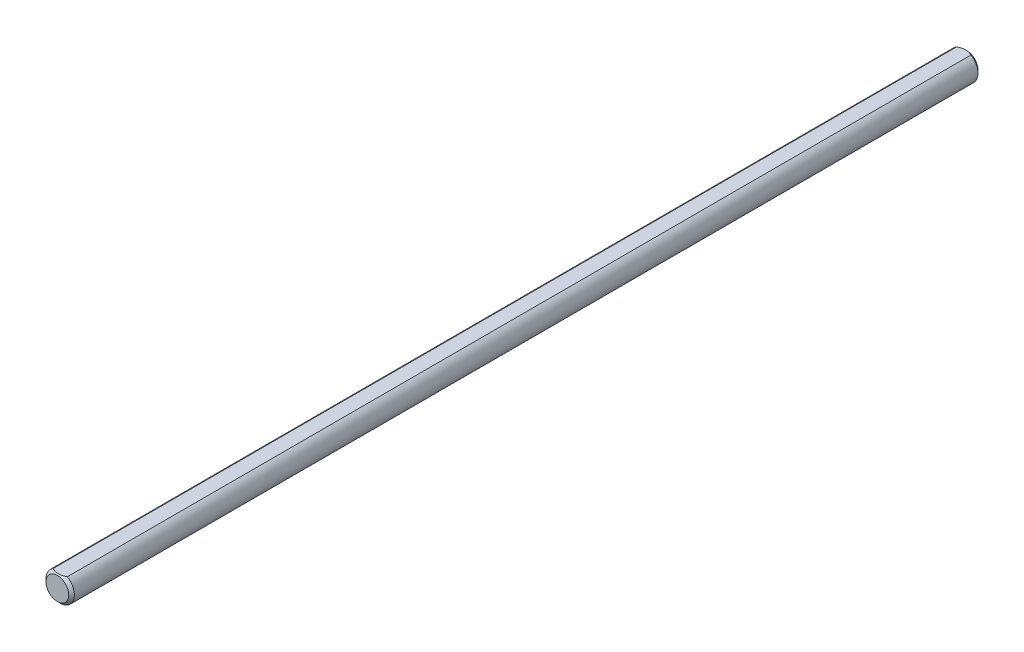
ISO-10303-21;
HEADER;
FILE_DESCRIPTION(('STEP AP214'),'2;1');
FILE_NAME('part.step','',(''),(''),'','','');
FILE_SCHEMA(('AUTOMOTIVE_DESIGN { 1 0 10303 214 1 1 1 1 }'));
ENDSEC;
DATA;
#1=APPLICATION_CONTEXT('core data for automotive mechanical design processes');
#2=APPLICATION_PROTOCOL_DEFINITION('international standard','automotive_design',2000,#1);
#3=PRODUCT_CONTEXT('',#1,'mechanical');
#4=PRODUCT('Part','Part','',(#3));
#5=PRODUCT_RELATED_PRODUCT_CATEGORY('part','',(#4));
#6=PRODUCT_DEFINITION_FORMATION('','',#4);
#7=PRODUCT_DEFINITION_CONTEXT('part definition',#1,'design');
#8=PRODUCT_DEFINITION('design','',#6,#7);
#9=PRODUCT_DEFINITION_SHAPE('','',#8);
#10=(LENGTH_UNIT() NAMED_UNIT(*) SI_UNIT(.MILLI.,.METRE.));
#11=(NAMED_UNIT(*) PLANE_ANGLE_UNIT() SI_UNIT($,.RADIAN.));
#12=(NAMED_UNIT(*) SI_UNIT($,.STERADIAN.) SOLID_ANGLE_UNIT());
#13=UNCERTAINTY_MEASURE_WITH_UNIT(LENGTH_MEASURE(1.E-05),#10,'distance_accuracy_value','');
#14=(GEOMETRIC_REPRESENTATION_CONTEXT(3) GLOBAL_UNCERTAINTY_ASSIGNED_CONTEXT((#13)) GLOBAL_UNIT_ASSIGNED_CONTEXT((#10,
#11,#12)) REPRESENTATION_CONTEXT('',''));
#15=CARTESIAN_POINT('',(0.,0.,0.));
#16=DIRECTION('',(0.,0.,1.));
#17=DIRECTION('',(1.,0.,0.));
#18=AXIS2_PLACEMENT_3D('',#15,#16,#17);
#19=CARTESIAN_POINT('',(0.,0.,101.6));
#20=DIRECTION('',(0.,0.,-1.));
#21=DIRECTION('',(-1.,0.,0.));
#22=AXIS2_PLACEMENT_3D('',#19,#20,#21);
#23=CYLINDRICAL_SURFACE('',#22,3.175);
#24=CARTESIAN_POINT('',(0.,0.,100.965));
#25=DIRECTION('',(0.,0.,1.));
#26=DIRECTION('',(1.,0.,0.));
#27=AXIS2_PLACEMENT_3D('',#24,#25,#26);
#28=CIRCLE('',#27,3.175);
#29=CARTESIAN_POINT('',(1.5875,2.74963065701559,100.965));
#30=VERTEX_POINT('',#29);
#31=CARTESIAN_POINT('',(-1.5875,2.74963065701559,100.965));
#32=VERTEX_POINT('',#31);
#33=EDGE_CURVE('E84',#30,#32,#28,.F.);
#34=ORIENTED_EDGE('',*,*,#33,.T.);
#35=DIRECTION('',(0.,0.,1.));
#36=VECTOR('',#35,1.);
#37=CARTESIAN_POINT('',(-1.5875,2.74963065701559,-101.6));
#38=LINE('',#37,#36);
#39=CARTESIAN_POINT('',(-1.5875,2.74963065701559,-100.965));
#40=VERTEX_POINT('',#39);
#41=EDGE_CURVE('E60',#40,#32,#38,.T.);
#42=ORIENTED_EDGE('',*,*,#41,.F.);
#43=CARTESIAN_POINT('',(0.,0.,-100.965));
#44=DIRECTION('',(0.,0.,1.));
#45=DIRECTION('',(1.,0.,0.));
#46=AXIS2_PLACEMENT_3D('',#43,#44,#45);
#47=CIRCLE('',#46,3.175);
#48=CARTESIAN_POINT('',(1.5875,2.74963065701559,-100.965));
#49=VERTEX_POINT('',#48);
#50=EDGE_CURVE('E82',#40,#49,#47,.T.);
#51=ORIENTED_EDGE('',*,*,#50,.T.);
#52=DIRECTION('',(0.,0.,1.));
#53=VECTOR('',#52,1.);
#54=CARTESIAN_POINT('',(1.5875,2.74963065701559,-101.6));
#55=LINE('',#54,#53);
#56=EDGE_CURVE('E70',#49,#30,#55,.T.);
#57=ORIENTED_EDGE('',*,*,#56,.T.);
#58=EDGE_LOOP('',(#34,#42,#51,#57));
#59=FACE_BOUND('',#58,.T.);
#60=ADVANCED_FACE('F39',(#59),#23,.T.);
#61=CARTESIAN_POINT('',(0.,0.,101.6));
#62=DIRECTION('',(0.,0.,1.));
#63=DIRECTION('',(1.,0.,0.));
#64=AXIS2_PLACEMENT_3D('',#61,#62,#63);
#65=PLANE('',#64);
#66=CARTESIAN_POINT('',(0.,0.,101.6));
#67=DIRECTION('',(0.,0.,1.));
#68=DIRECTION('',(1.,0.,0.));
#69=AXIS2_PLACEMENT_3D('',#66,#67,#68);
#70=CIRCLE('',#69,2.54000000000004);
#71=CARTESIAN_POINT('',(2.54000000000004,0.,101.6));
#72=VERTEX_POINT('',#71);
#73=EDGE_CURVE('E54',#72,#72,#70,.T.);
#74=ORIENTED_EDGE('',*,*,#73,.T.);
#75=EDGE_LOOP('',(#74));
#76=FACE_BOUND('',#75,.T.);
#77=ADVANCED_FACE('F98',(#76),#65,.T.);
#78=CARTESIAN_POINT('',(0.,0.,-101.6));
#79=DIRECTION('',(0.,0.,1.));
#80=DIRECTION('',(1.,0.,0.));
#81=AXIS2_PLACEMENT_3D('',#78,#79,#80);
#82=PLANE('',#81);
#83=CARTESIAN_POINT('',(0.,0.,-101.6));
#84=DIRECTION('',(0.,0.,1.));
#85=DIRECTION('',(1.,0.,0.));
#86=AXIS2_PLACEMENT_3D('',#83,#84,#85);
#87=CIRCLE('',#86,2.54000000000004);
#88=CARTESIAN_POINT('',(2.54000000000004,0.,-101.6));
#89=VERTEX_POINT('',#88);
#90=EDGE_CURVE('E87',#89,#89,#87,.F.);
#91=ORIENTED_EDGE('',*,*,#90,.T.);
#92=EDGE_LOOP('',(#91));
#93=FACE_BOUND('',#92,.T.);
#94=ADVANCED_FACE('F106',(#93),#82,.F.);
#95=CARTESIAN_POINT('',(0.,0.,-100.965));
#96=DIRECTION('',(0.,0.,1.));
#97=DIRECTION('',(1.,0.,0.));
#98=AXIS2_PLACEMENT_3D('',#95,#96,#97);
#99=CONICAL_SURFACE('',#98,3.175,0.78539816339744);
#100=CARTESIAN_POINT('',(-3.22896135223729,2.74963065701559,-99.8989317189838));
#101=CARTESIAN_POINT('',(-3.15061649550104,2.74963065701559,-99.958566524546));
#102=CARTESIAN_POINT('',(-3.07184009651263,2.74963065701559,-100.017643482025));
#103=CARTESIAN_POINT('',(-2.91325130568818,2.74963065701559,-100.134429717618));
#104=CARTESIAN_POINT('',(-2.83343866506294,2.74963065701559,-100.192138657526));
#105=CARTESIAN_POINT('',(-2.67202062852746,2.74963065701559,-100.306347547805));
#106=CARTESIAN_POINT('',(-2.59040613970429,2.74963065701559,-100.362834689537));
#107=CARTESIAN_POINT('',(-2.42580311622164,2.74963065701559,-100.473763514334));
#108=CARTESIAN_POINT('',(-2.34281467809335,2.74963065701559,-100.528205340229));
#109=CARTESIAN_POINT('',(-2.17021447787229,2.74963065701559,-100.637773871166));
#110=CARTESIAN_POINT('',(-2.08050398524193,2.74963065701559,-100.69274583534));
#111=CARTESIAN_POINT('',(-1.89900904678691,2.74963065701559,-100.799146993198));
#112=CARTESIAN_POINT('',(-1.80722487525635,2.74963065701559,-100.850576651835));
#113=CARTESIAN_POINT('',(-1.6215376036893,2.74963065701559,-100.948814805051));
#114=CARTESIAN_POINT('',(-1.52764140922494,2.74963065701559,-100.995636250177));
#115=CARTESIAN_POINT('',(-1.337247065721,2.74963065701559,-101.083600815341));
#116=CARTESIAN_POINT('',(-1.24075014112708,2.74963065701559,-101.124746553594));
#117=CARTESIAN_POINT('',(-1.05364742760749,2.74963065701559,-101.196556437231));
#118=CARTESIAN_POINT('',(-0.963276425588649,2.74963065701559,-101.227826043973));
#119=CARTESIAN_POINT('',(-0.780303735161117,2.74963065701559,-101.28312318735));
#120=CARTESIAN_POINT('',(-0.687701898779476,2.74963065701559,-101.307150242145));
#121=CARTESIAN_POINT('',(-0.502391431282867,2.74963065701559,-101.346288290841));
#122=CARTESIAN_POINT('',(-0.409716445146773,2.74963065701559,-101.361555954749));
#123=CARTESIAN_POINT('',(-0.223306330685287,2.74963065701559,-101.382868842029));
#124=CARTESIAN_POINT('',(-0.129571403437391,2.74963065701559,-101.388915786014));
#125=CARTESIAN_POINT('',(0.0543357559016512,2.74963065701559,-101.391309485248));
#126=CARTESIAN_POINT('',(0.144503242552339,2.74963065701559,-101.388028086228));
#127=CARTESIAN_POINT('',(0.324095543573382,2.74963065701559,-101.372781771964));
#128=CARTESIAN_POINT('',(0.413520286896835,2.74963065701559,-101.360816035481));
#129=CARTESIAN_POINT('',(0.59249606602404,2.74963065701559,-101.328661523536));
#130=CARTESIAN_POINT('',(0.682021177378985,2.74963065701559,-101.308330580175));
#131=CARTESIAN_POINT('',(0.859103373963789,2.74963065701559,-101.260545197954));
#132=CARTESIAN_POINT('',(0.946660601088747,2.74963065701559,-101.233091274501));
#133=CARTESIAN_POINT('',(1.21954622680458,2.74963065701559,-101.13712948219));
#134=CARTESIAN_POINT('',(1.4010859401266,2.74963065701559,-101.057809452736));
#135=CARTESIAN_POINT('',(1.66675889489853,2.74963065701559,-100.925553985226));
#136=CARTESIAN_POINT('',(1.7543748838501,2.74963065701559,-100.879152661124));
#137=CARTESIAN_POINT('',(1.92761951465593,2.74963065701559,-100.782769237768));
#138=CARTESIAN_POINT('',(2.01324850705449,2.74963065701559,-100.732787776576));
#139=CARTESIAN_POINT('',(2.17855184285728,2.74963065701559,-100.632513843306));
#140=CARTESIAN_POINT('',(2.25831097248792,2.74963065701559,-100.58235955904));
#141=CARTESIAN_POINT('',(2.41646118639988,2.74963065701559,-100.479928217763));
#142=CARTESIAN_POINT('',(2.49485216688168,2.74963065701559,-100.427651000681));
#143=CARTESIAN_POINT('',(2.64980987258619,2.74963065701559,-100.321783125056));
#144=CARTESIAN_POINT('',(2.72638621983948,2.74963065701559,-100.268206491774));
#145=CARTESIAN_POINT('',(2.87849044969156,2.74963065701559,-100.159627090017));
#146=CARTESIAN_POINT('',(2.95401861519251,2.74963065701559,-100.104624718309));
#147=CARTESIAN_POINT('',(3.02910770969612,2.74963065701559,-100.049038955583));
#148=B_SPLINE_CURVE_WITH_KNOTS('',3,(#100,#101,#102,#103,#104,#105,#106,#107,#108,#109,#110,
#111,#112,#113,#114,#115,#116,#117,#118,#119,#120,#121,#122,#123,#124,#125,#126,#127,#128,#129,
#130,#131,#132,#133,#134,#135,#136,#137,#138,#139,#140,#141,#142,#143,#144,#145,#146,#147),
.UNSPECIFIED.,.F.,.F.,(4,2,2,2,2,2,2,2,2,2,2,2,2,2,2,2,2,2,2,2,2,2,2,4),(0.,0.295383449271203,
0.590839178498779,0.888580871622938,1.18630173399068,1.50187785569755,1.81741247644345,
2.13203338294821,2.44650866534174,2.73314264689633,3.0197956937383,3.30114758261622,
3.58244696402022,3.8526922629349,4.12296312107184,4.39803055604394,4.67307809311867,
5.26557071241304,5.56297998480371,5.86033638333456,6.14295523590865,6.4255954379691,
6.70595195130103,6.98623126477248),.UNSPECIFIED.);
#149=EDGE_CURVE('E65',#49,#40,#148,.F.);
#150=ORIENTED_EDGE('',*,*,#149,.F.);
#151=ORIENTED_EDGE('',*,*,#50,.F.);
#152=EDGE_LOOP('',(#150,#151));
#153=FACE_BOUND('',#152,.T.);
#154=ORIENTED_EDGE('',*,*,#90,.F.);
#155=EDGE_LOOP('',(#154));
#156=FACE_BOUND('',#155,.T.);
#157=ADVANCED_FACE('F80',(#153,#156),#99,.T.);
#158=CARTESIAN_POINT('',(0.,0.,101.6));
#159=DIRECTION('',(0.,0.,-1.));
#160=DIRECTION('',(-1.,0.,0.));
#161=AXIS2_PLACEMENT_3D('',#158,#159,#160);
#162=CONICAL_SURFACE('',#161,2.54000000000004,0.78539816339744);
#163=CARTESIAN_POINT('',(-3.22896135223729,2.74963065701559,99.8989317189838));
#164=CARTESIAN_POINT('',(-3.15061649550104,2.74963065701559,99.958566524546));
#165=CARTESIAN_POINT('',(-3.07184009651263,2.74963065701559,100.017643482025));
#166=CARTESIAN_POINT('',(-2.91325130568818,2.74963065701559,100.134429717618));
#167=CARTESIAN_POINT('',(-2.83343866506294,2.74963065701559,100.192138657526));
#168=CARTESIAN_POINT('',(-2.67202062852746,2.74963065701559,100.306347547805));
#169=CARTESIAN_POINT('',(-2.59040613970429,2.74963065701559,100.362834689537));
#170=CARTESIAN_POINT('',(-2.42580311622164,2.74963065701559,100.473763514334));
#171=CARTESIAN_POINT('',(-2.34281467809335,2.74963065701559,100.528205340229));
#172=CARTESIAN_POINT('',(-2.17021447787229,2.74963065701559,100.637773871166));
#173=CARTESIAN_POINT('',(-2.08050398524194,2.74963065701559,100.69274583534));
#174=CARTESIAN_POINT('',(-1.89900904678692,2.74963065701559,100.799146993198));
#175=CARTESIAN_POINT('',(-1.80722487525635,2.74963065701559,100.850576651835));
#176=CARTESIAN_POINT('',(-1.6215376036893,2.74963065701559,100.948814805051));
#177=CARTESIAN_POINT('',(-1.52764140922495,2.74963065701559,100.995636250177));
#178=CARTESIAN_POINT('',(-1.33724706572101,2.74963065701559,101.083600815341));
#179=CARTESIAN_POINT('',(-1.24075014112709,2.74963065701559,101.124746553594));
#180=CARTESIAN_POINT('',(-1.05364742760749,2.74963065701559,101.196556437231));
#181=CARTESIAN_POINT('',(-0.963276425588649,2.74963065701559,101.227826043973));
#182=CARTESIAN_POINT('',(-0.780303735161117,2.74963065701559,101.28312318735));
#183=CARTESIAN_POINT('',(-0.687701898779476,2.74963065701559,101.307150242145));
#184=CARTESIAN_POINT('',(-0.502391431282867,2.74963065701559,101.346288290841));
#185=CARTESIAN_POINT('',(-0.409716445146773,2.74963065701559,101.361555954749));
#186=CARTESIAN_POINT('',(-0.223306330685287,2.74963065701559,101.382868842029));
#187=CARTESIAN_POINT('',(-0.129571403437391,2.74963065701559,101.388915786014));
#188=CARTESIAN_POINT('',(0.0543357559016514,2.74963065701559,101.391309485248));
#189=CARTESIAN_POINT('',(0.144503242552339,2.74963065701559,101.388028086228));
#190=CARTESIAN_POINT('',(0.324095543573382,2.74963065701559,101.372781771964));
#191=CARTESIAN_POINT('',(0.413520286896835,2.74963065701559,101.360816035481));
#192=CARTESIAN_POINT('',(0.59249606602404,2.74963065701559,101.328661523536));
#193=CARTESIAN_POINT('',(0.682021177378985,2.74963065701559,101.308330580175));
#194=CARTESIAN_POINT('',(0.859103373963788,2.74963065701559,101.260545197954));
#195=CARTESIAN_POINT('',(0.946660601088746,2.74963065701559,101.233091274501));
#196=CARTESIAN_POINT('',(1.21954622680458,2.74963065701559,101.13712948219));
#197=CARTESIAN_POINT('',(1.4010859401266,2.74963065701559,101.057809452736));
#198=CARTESIAN_POINT('',(1.66675889489852,2.74963065701559,100.925553985226));
#199=CARTESIAN_POINT('',(1.75437488385009,2.74963065701559,100.879152661124));
#200=CARTESIAN_POINT('',(1.92761951465591,2.74963065701559,100.782769237768));
#201=CARTESIAN_POINT('',(2.01324850705447,2.74963065701559,100.732787776576));
#202=CARTESIAN_POINT('',(2.17855184285727,2.74963065701559,100.632513843306));
#203=CARTESIAN_POINT('',(2.25831097248791,2.74963065701559,100.58235955904));
#204=CARTESIAN_POINT('',(2.41646118639987,2.74963065701559,100.479928217763));
#205=CARTESIAN_POINT('',(2.49485216688168,2.74963065701559,100.427651000681));
#206=CARTESIAN_POINT('',(2.64980987258619,2.74963065701559,100.321783125056));
#207=CARTESIAN_POINT('',(2.72638621983948,2.74963065701559,100.268206491774));
#208=CARTESIAN_POINT('',(2.87849044969156,2.74963065701559,100.159627090017));
#209=CARTESIAN_POINT('',(2.9540186151925,2.74963065701559,100.104624718309));
#210=CARTESIAN_POINT('',(3.02910770969612,2.74963065701559,100.049038955583));
#211=B_SPLINE_CURVE_WITH_KNOTS('',3,(#163,#164,#165,#166,#167,#168,#169,#170,#171,#172,#173,
#174,#175,#176,#177,#178,#179,#180,#181,#182,#183,#184,#185,#186,#187,#188,#189,#190,#191,#192,
#193,#194,#195,#196,#197,#198,#199,#200,#201,#202,#203,#204,#205,#206,#207,#208,#209,#210),
.UNSPECIFIED.,.F.,.F.,(4,2,2,2,2,2,2,2,2,2,2,2,2,2,2,2,2,2,2,2,2,2,2,4),(0.,0.295383449271203,
0.590839178498779,0.888580871622938,1.18630173399068,1.50187785569754,1.81741247644345,
2.1320333829482,2.44650866534174,2.73314264689633,3.0197956937383,3.30114758261622,
3.58244696402022,3.8526922629349,4.12296312107184,4.39803055604394,4.67307809311867,
5.26557071241303,5.5629799848037,5.86033638333455,6.14295523590865,6.42559543796911,
6.70595195130104,6.98623126477248),.UNSPECIFIED.);
#212=EDGE_CURVE('E11',#32,#30,#211,.T.);
#213=ORIENTED_EDGE('',*,*,#212,.F.);
#214=ORIENTED_EDGE('',*,*,#33,.F.);
#215=EDGE_LOOP('',(#213,#214));
#216=FACE_BOUND('',#215,.T.);
#217=ORIENTED_EDGE('',*,*,#73,.F.);
#218=EDGE_LOOP('',(#217));
#219=FACE_BOUND('',#218,.T.);
#220=ADVANCED_FACE('F41',(#216,#219),#162,.T.);
#221=CARTESIAN_POINT('',(-1.5875,2.74963065701559,-101.6));
#222=DIRECTION('',(0.,-1.,0.));
#223=DIRECTION('',(0.,0.,-1.));
#224=AXIS2_PLACEMENT_3D('',#221,#222,#223);
#225=PLANE('',#224);
#226=ORIENTED_EDGE('',*,*,#149,.T.);
#227=ORIENTED_EDGE('',*,*,#41,.T.);
#228=ORIENTED_EDGE('',*,*,#212,.T.);
#229=ORIENTED_EDGE('',*,*,#56,.F.);
#230=EDGE_LOOP('',(#226,#227,#228,#229));
#231=FACE_BOUND('',#230,.T.);
#232=ADVANCED_FACE('F71',(#231),#225,.F.);
#233=CLOSED_SHELL('',(#60,#77,#94,#157,#220,#232));
#234=MANIFOLD_SOLID_BREP('B2',#233);
#235=ADVANCED_BREP_SHAPE_REPRESENTATION('',(#18,#234),#14);
#236=SHAPE_DEFINITION_REPRESENTATION(#9,#235);
ENDSEC;
END-ISO-10303-21;
